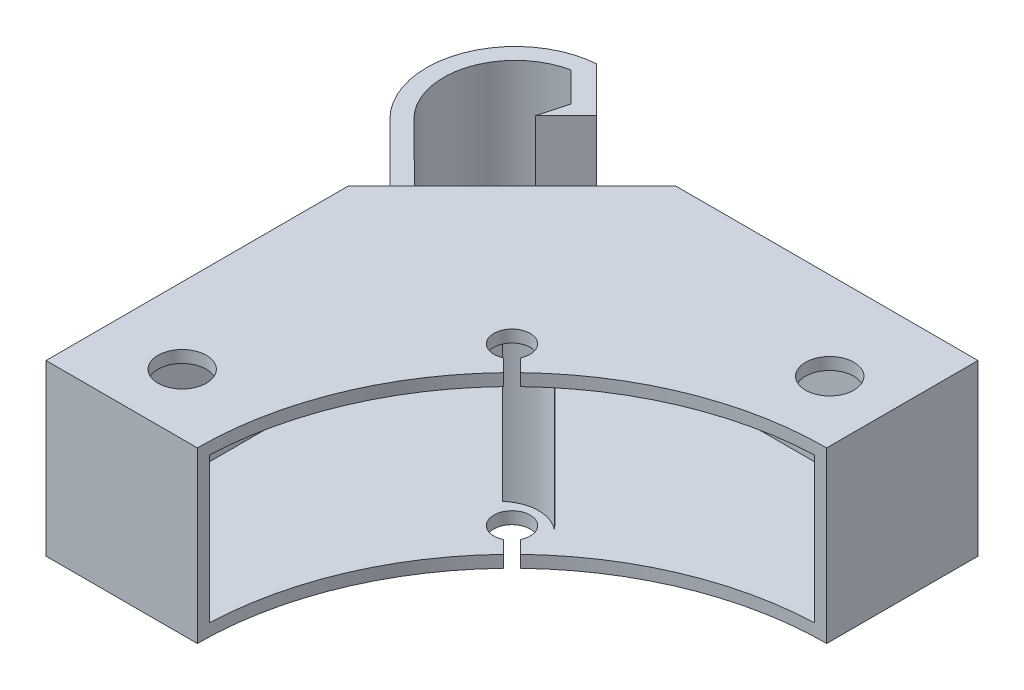
ISO-10303-21;
HEADER;
FILE_DESCRIPTION(('STEP AP214'),'2;1');
FILE_NAME('part.step','',(''),(''),'','','');
FILE_SCHEMA(('AUTOMOTIVE_DESIGN { 1 0 10303 214 1 1 1 1 }'));
ENDSEC;
DATA;
#1=APPLICATION_CONTEXT('core data for automotive mechanical design processes');
#2=APPLICATION_PROTOCOL_DEFINITION('international standard','automotive_design',2000,#1);
#3=PRODUCT_CONTEXT('',#1,'mechanical');
#4=PRODUCT('Part','Part','',(#3));
#5=PRODUCT_RELATED_PRODUCT_CATEGORY('part','',(#4));
#6=PRODUCT_DEFINITION_FORMATION('','',#4);
#7=PRODUCT_DEFINITION_CONTEXT('part definition',#1,'design');
#8=PRODUCT_DEFINITION('design','',#6,#7);
#9=PRODUCT_DEFINITION_SHAPE('','',#8);
#10=(LENGTH_UNIT() NAMED_UNIT(*) SI_UNIT(.MILLI.,.METRE.));
#11=(NAMED_UNIT(*) PLANE_ANGLE_UNIT() SI_UNIT($,.RADIAN.));
#12=(NAMED_UNIT(*) SI_UNIT($,.STERADIAN.) SOLID_ANGLE_UNIT());
#13=UNCERTAINTY_MEASURE_WITH_UNIT(LENGTH_MEASURE(1.E-05),#10,'distance_accuracy_value','');
#14=(GEOMETRIC_REPRESENTATION_CONTEXT(3) GLOBAL_UNCERTAINTY_ASSIGNED_CONTEXT((#13)) GLOBAL_UNIT_ASSIGNED_CONTEXT((#10,
#11,#12)) REPRESENTATION_CONTEXT('',''));
#15=CARTESIAN_POINT('',(0.,0.,0.));
#16=DIRECTION('',(0.,0.,1.));
#17=DIRECTION('',(1.,0.,0.));
#18=AXIS2_PLACEMENT_3D('',#15,#16,#17);
#19=CARTESIAN_POINT('',(-20.50609665441,27.,-71.9203102167828));
#20=DIRECTION('',(0.,-1.,0.));
#21=DIRECTION('',(0.,0.,-1.));
#22=AXIS2_PLACEMENT_3D('',#19,#20,#21);
#23=PLANE('',#22);
#24=DIRECTION('',(0.71037370162736,0.,0.703824696949633));
#25=VECTOR('',#24,1.);
#26=CARTESIAN_POINT('',(-15.8873615053741,27.,-76.5820221443081));
#27=LINE('',#26,#25);
#28=CARTESIAN_POINT('',(-5.15351595946739,27.,-65.9471329709827));
#29=VERTEX_POINT('',#28);
#30=CARTESIAN_POINT('',(5.44566595344239,27.,-55.4456659534424));
#31=VERTEX_POINT('',#30);
#32=EDGE_CURVE('E285',#29,#31,#27,.T.);
#33=ORIENTED_EDGE('',*,*,#32,.F.);
#34=CARTESIAN_POINT('',(3.17640056931442,27.,-74.3545583773991));
#35=DIRECTION('',(0.,-1.,0.));
#36=DIRECTION('',(0.,0.,-1.));
#37=AXIS2_PLACEMENT_3D('',#34,#35,#36);
#38=CIRCLE('',#37,11.8352148835975);
#39=CARTESIAN_POINT('',(0.807292373089444,27.,-85.9502316090622));
#40=VERTEX_POINT('',#39);
#41=EDGE_CURVE('E281',#40,#29,#38,.F.);
#42=ORIENTED_EDGE('',*,*,#41,.F.);
#43=DIRECTION('',(-0.707106781186548,0.,-0.707106781186547));
#44=VECTOR('',#43,1.);
#45=CARTESIAN_POINT('',(-2.83444144452059,27.,-89.5919654266722));
#46=LINE('',#45,#44);
#47=CARTESIAN_POINT('',(5.67104255263289,27.,-81.0864814295187));
#48=VERTEX_POINT('',#47);
#49=EDGE_CURVE('E277',#48,#40,#46,.T.);
#50=ORIENTED_EDGE('',*,*,#49,.F.);
#51=DIRECTION('',(0.265706176141184,0.,-0.964054058629717));
#52=VECTOR('',#51,1.);
#53=CARTESIAN_POINT('',(1.47498082783507,27.,-65.8620316451724));
#54=LINE('',#53,#52);
#55=CARTESIAN_POINT('',(4.41044873230969,27.,-76.512705213943));
#56=VERTEX_POINT('',#55);
#57=EDGE_CURVE('E270',#56,#48,#54,.T.);
#58=ORIENTED_EDGE('',*,*,#57,.F.);
#59=DIRECTION('',(-0.707106781186547,0.,0.707106781186548));
#60=VECTOR('',#59,1.);
#61=CARTESIAN_POINT('',(-10.3440214596303,27.,-61.758235022003));
#62=LINE('',#61,#60);
#63=CARTESIAN_POINT('',(9.4489540938188,27.,-81.5512105754521));
#64=VERTEX_POINT('',#63);
#65=EDGE_CURVE('E264',#64,#56,#62,.T.);
#66=ORIENTED_EDGE('',*,*,#65,.F.);
#67=DIRECTION('',(0.707106781186548,0.,0.707106781186547));
#68=VECTOR('',#67,1.);
#69=CARTESIAN_POINT('',(-0.713121100960917,27.,-91.7132857702318));
#70=LINE('',#69,#68);
#71=CARTESIAN_POINT('',(2.04781425632615,27.,-88.9523504129448));
#72=VERTEX_POINT('',#71);
#73=EDGE_CURVE('E243',#72,#64,#70,.T.);
#74=ORIENTED_EDGE('',*,*,#73,.F.);
#75=CARTESIAN_POINT('',(3.17640056931442,27.,-74.3545583773991));
#76=DIRECTION('',(0.,-1.,0.));
#77=DIRECTION('',(0.,0.,-1.));
#78=AXIS2_PLACEMENT_3D('',#75,#76,#77);
#79=CIRCLE('',#78,14.641353741335);
#80=CARTESIAN_POINT('',(-7.17659994693462,27.,-64.00155786115));
#81=VERTEX_POINT('',#80);
#82=EDGE_CURVE('E251',#81,#72,#79,.T.);
#83=ORIENTED_EDGE('',*,*,#82,.F.);
#84=DIRECTION('',(-0.707106781186547,0.,-0.707106781186548));
#85=VECTOR('',#84,1.);
#86=CARTESIAN_POINT('',(-17.8007244784887,27.,-74.6256823927041));
#87=LINE('',#86,#85);
#88=CARTESIAN_POINT('',(3.41247895710775,27.,-53.4124789571077));
#89=VERTEX_POINT('',#88);
#90=EDGE_CURVE('E259',#89,#81,#87,.T.);
#91=ORIENTED_EDGE('',*,*,#90,.F.);
#92=DIRECTION('',(0.707106781186543,0.,-0.707106781186551));
#93=VECTOR('',#92,1.);
#94=CARTESIAN_POINT('',(0.707106781186548,27.,-50.7071067811865));
#95=LINE('',#94,#93);
#96=EDGE_CURVE('E310',#89,#31,#95,.T.);
#97=ORIENTED_EDGE('',*,*,#96,.T.);
#98=EDGE_LOOP('',(#33,#42,#50,#58,#66,#74,#83,#91,#97));
#99=FACE_BOUND('',#98,.T.);
#100=ADVANCED_FACE('F37',(#99),#23,.F.);
#101=CARTESIAN_POINT('',(26.9999999999998,28.,-77.));
#102=DIRECTION('',(0.707106781186552,0.,0.707106781186543));
#103=DIRECTION('',(0.707106781186543,0.,-0.707106781186552));
#104=AXIS2_PLACEMENT_3D('',#101,#102,#103);
#105=PLANE('',#104);
#106=DIRECTION('',(0.,1.,0.));
#107=VECTOR('',#106,1.);
#108=CARTESIAN_POINT('',(3.41247895710775,-3.,-53.4124789571077));
#109=LINE('',#108,#107);
#110=CARTESIAN_POINT('',(3.41247895710775,1.,-53.4124789571077));
#111=VERTEX_POINT('',#110);
#112=EDGE_CURVE('E311',#111,#89,#109,.T.);
#113=ORIENTED_EDGE('',*,*,#112,.F.);
#114=DIRECTION('',(-0.707106781186543,0.,0.707106781186551));
#115=VECTOR('',#114,1.);
#116=CARTESIAN_POINT('',(26.2928932188132,1.,-76.2928932188134));
#117=LINE('',#116,#115);
#118=CARTESIAN_POINT('',(5.44566595344239,1.,-55.4456659534424));
#119=VERTEX_POINT('',#118);
#120=EDGE_CURVE('E314',#119,#111,#117,.T.);
#121=ORIENTED_EDGE('',*,*,#120,.F.);
#122=DIRECTION('',(0.,1.,0.));
#123=VECTOR('',#122,1.);
#124=CARTESIAN_POINT('',(5.44566595344239,-3.,-55.4456659534424));
#125=LINE('',#124,#123);
#126=EDGE_CURVE('E316',#119,#31,#125,.T.);
#127=ORIENTED_EDGE('',*,*,#126,.T.);
#128=ORIENTED_EDGE('',*,*,#96,.F.);
#129=EDGE_LOOP('',(#113,#121,#127,#128));
#130=FACE_BOUND('',#129,.T.);
#131=DIRECTION('',(-0.707106781186543,0.,0.707106781186552));
#132=VECTOR('',#131,1.);
#133=CARTESIAN_POINT('',(26.9999999999998,0.,-77.));
#134=LINE('',#133,#132);
#135=CARTESIAN_POINT('',(26.9999999999998,0.,-77.));
#136=VERTEX_POINT('',#135);
#137=CARTESIAN_POINT('',(0.,0.,-49.9999999999999));
#138=VERTEX_POINT('',#137);
#139=EDGE_CURVE('E464',#136,#138,#134,.T.);
#140=ORIENTED_EDGE('',*,*,#139,.T.);
#141=DIRECTION('',(0.,-1.,0.));
#142=VECTOR('',#141,1.);
#143=CARTESIAN_POINT('',(0.,28.,-49.9999999999999));
#144=LINE('',#143,#142);
#145=CARTESIAN_POINT('',(0.,28.,-49.9999999999999));
#146=VERTEX_POINT('',#145);
#147=EDGE_CURVE('E469',#146,#138,#144,.T.);
#148=ORIENTED_EDGE('',*,*,#147,.F.);
#149=DIRECTION('',(-0.707106781186543,0.,0.707106781186552));
#150=VECTOR('',#149,1.);
#151=CARTESIAN_POINT('',(26.9999999999998,28.,-77.));
#152=LINE('',#151,#150);
#153=CARTESIAN_POINT('',(26.9999999999998,28.,-77.));
#154=VERTEX_POINT('',#153);
#155=EDGE_CURVE('E439',#154,#146,#152,.T.);
#156=ORIENTED_EDGE('',*,*,#155,.F.);
#157=DIRECTION('',(0.,-1.,0.));
#158=VECTOR('',#157,1.);
#159=CARTESIAN_POINT('',(26.9999999999998,28.,-77.));
#160=LINE('',#159,#158);
#161=EDGE_CURVE('E472',#154,#136,#160,.T.);
#162=ORIENTED_EDGE('',*,*,#161,.T.);
#163=EDGE_LOOP('',(#140,#148,#156,#162));
#164=FACE_BOUND('',#163,.T.);
#165=ADVANCED_FACE('F557',(#130,#164),#105,.F.);
#166=CARTESIAN_POINT('',(39.5301403295098,28.,-36.055646108117));
#167=DIRECTION('',(-0.707106781186547,0.,0.707106781186547));
#168=DIRECTION('',(0.707106781186548,0.,0.707106781186548));
#169=AXIS2_PLACEMENT_3D('',#166,#167,#168);
#170=PLANE('',#169);
#171=DIRECTION('',(-0.707106781186548,0.,-0.707106781186548));
#172=VECTOR('',#171,1.);
#173=CARTESIAN_POINT('',(39.5301403295098,2.,-36.055646108117));
#174=LINE('',#173,#172);
#175=CARTESIAN_POINT('',(39.5301403295098,2.,-36.055646108117));
#176=VERTEX_POINT('',#175);
#177=CARTESIAN_POINT('',(37.4088199859502,2.,-38.1769664516767));
#178=VERTEX_POINT('',#177);
#179=EDGE_CURVE('E353',#176,#178,#174,.T.);
#180=ORIENTED_EDGE('',*,*,#179,.F.);
#181=DIRECTION('',(0.,-1.,0.));
#182=VECTOR('',#181,1.);
#183=CARTESIAN_POINT('',(39.5301403295098,28.,-36.055646108117));
#184=LINE('',#183,#182);
#185=CARTESIAN_POINT('',(39.5301403295098,0.,-36.055646108117));
#186=VERTEX_POINT('',#185);
#187=EDGE_CURVE('E493',#176,#186,#184,.T.);
#188=ORIENTED_EDGE('',*,*,#187,.T.);
#189=DIRECTION('',(-0.707106781186548,0.,-0.707106781186548));
#190=VECTOR('',#189,1.);
#191=CARTESIAN_POINT('',(39.5301403295098,0.,-36.055646108117));
#192=LINE('',#191,#190);
#193=CARTESIAN_POINT('',(37.4088199859502,0.,-38.1769664516767));
#194=VERTEX_POINT('',#193);
#195=EDGE_CURVE('E449',#186,#194,#192,.T.);
#196=ORIENTED_EDGE('',*,*,#195,.T.);
#197=DIRECTION('',(0.,-1.,0.));
#198=VECTOR('',#197,1.);
#199=CARTESIAN_POINT('',(37.4088199859502,28.,-38.1769664516767));
#200=LINE('',#199,#198);
#201=EDGE_CURVE('E489',#178,#194,#200,.T.);
#202=ORIENTED_EDGE('',*,*,#201,.F.);
#203=EDGE_LOOP('',(#180,#188,#196,#202));
#204=FACE_BOUND('',#203,.T.);
#205=ADVANCED_FACE('F527',(#204),#170,.F.);
#206=CARTESIAN_POINT('',(36.1159267671368,28.,-40.8840732328633));
#207=DIRECTION('',(0.,-1.,0.));
#208=DIRECTION('',(0.,0.,-1.));
#209=AXIS2_PLACEMENT_3D('',#206,#207,#208);
#210=CYLINDRICAL_SURFACE('',#209,3.00000000000001);
#211=CARTESIAN_POINT('',(36.1159267671368,2.,-40.8840732328633));
#212=DIRECTION('',(0.,1.,0.));
#213=DIRECTION('',(0.,0.,1.));
#214=AXIS2_PLACEMENT_3D('',#211,#212,#213);
#215=CIRCLE('',#214,3.00000000000001);
#216=CARTESIAN_POINT('',(38.8230335483233,2.,-39.5911800140498));
#217=VERTEX_POINT('',#216);
#218=EDGE_CURVE('E355',#178,#217,#215,.F.);
#219=ORIENTED_EDGE('',*,*,#218,.F.);
#220=ORIENTED_EDGE('',*,*,#201,.T.);
#221=CARTESIAN_POINT('',(36.1159267671368,0.,-40.8840732328633));
#222=DIRECTION('',(0.,-1.,0.));
#223=DIRECTION('',(0.,0.,-1.));
#224=AXIS2_PLACEMENT_3D('',#221,#222,#223);
#225=CIRCLE('',#224,3.00000000000001);
#226=CARTESIAN_POINT('',(38.8230335483233,0.,-39.5911800140498));
#227=VERTEX_POINT('',#226);
#228=EDGE_CURVE('E452',#194,#227,#225,.T.);
#229=ORIENTED_EDGE('',*,*,#228,.T.);
#230=DIRECTION('',(0.,-1.,0.));
#231=VECTOR('',#230,1.);
#232=CARTESIAN_POINT('',(38.8230335483233,28.,-39.5911800140498));
#233=LINE('',#232,#231);
#234=EDGE_CURVE('E485',#217,#227,#233,.T.);
#235=ORIENTED_EDGE('',*,*,#234,.F.);
#236=EDGE_LOOP('',(#219,#220,#229,#235));
#237=FACE_BOUND('',#236,.T.);
#238=ADVANCED_FACE('F579',(#237),#210,.F.);
#239=CARTESIAN_POINT('',(40.9443538918829,28.,-37.4698596704901));
#240=DIRECTION('',(0.707106781186547,0.,-0.707106781186547));
#241=DIRECTION('',(-0.707106781186548,0.,-0.707106781186548));
#242=AXIS2_PLACEMENT_3D('',#239,#240,#241);
#243=PLANE('',#242);
#244=DIRECTION('',(0.707106781186548,0.,0.707106781186548));
#245=VECTOR('',#244,1.);
#246=CARTESIAN_POINT('',(40.9443538918829,2.,-37.4698596704901));
#247=LINE('',#246,#245);
#248=CARTESIAN_POINT('',(40.9443538918829,2.,-37.4698596704902));
#249=VERTEX_POINT('',#248);
#250=EDGE_CURVE('E357',#217,#249,#247,.T.);
#251=ORIENTED_EDGE('',*,*,#250,.F.);
#252=ORIENTED_EDGE('',*,*,#234,.T.);
#253=DIRECTION('',(0.707106781186548,0.,0.707106781186548));
#254=VECTOR('',#253,1.);
#255=CARTESIAN_POINT('',(40.9443538918829,0.,-37.4698596704901));
#256=LINE('',#255,#254);
#257=CARTESIAN_POINT('',(40.9443538918829,0.,-37.4698596704901));
#258=VERTEX_POINT('',#257);
#259=EDGE_CURVE('E455',#227,#258,#256,.T.);
#260=ORIENTED_EDGE('',*,*,#259,.T.);
#261=DIRECTION('',(0.,-1.,0.));
#262=VECTOR('',#261,1.);
#263=CARTESIAN_POINT('',(40.9443538918829,28.,-37.4698596704901));
#264=LINE('',#263,#262);
#265=EDGE_CURVE('E481',#249,#258,#264,.T.);
#266=ORIENTED_EDGE('',*,*,#265,.F.);
#267=EDGE_LOOP('',(#251,#252,#260,#266));
#268=FACE_BOUND('',#267,.T.);
#269=ADVANCED_FACE('F576',(#268),#243,.F.);
#270=CARTESIAN_POINT('',(36.1159267671368,28.,-40.8840732328633));
#271=DIRECTION('',(0.,-1.,0.));
#272=DIRECTION('',(0.,0.,-1.));
#273=AXIS2_PLACEMENT_3D('',#270,#271,#272);
#274=CYLINDRICAL_SURFACE('',#273,5.00000000000001);
#275=CARTESIAN_POINT('',(36.1159267671368,2.,-40.8840732328633));
#276=DIRECTION('',(0.,1.,0.));
#277=DIRECTION('',(0.,0.,1.));
#278=AXIS2_PLACEMENT_3D('',#275,#276,#277);
#279=CIRCLE('',#278,5.00000000000001);
#280=CARTESIAN_POINT('',(31.8958750480032,2.,-43.5657077135182));
#281=VERTEX_POINT('',#280);
#282=CARTESIAN_POINT('',(40.1486244214815,2.,-43.839974047952));
#283=VERTEX_POINT('',#282);
#284=EDGE_CURVE('E409',#281,#283,#279,.F.);
#285=ORIENTED_EDGE('',*,*,#284,.F.);
#286=DIRECTION('',(0.,-1.,0.));
#287=VECTOR('',#286,1.);
#288=CARTESIAN_POINT('',(31.8958750480032,14.,-43.5657077135182));
#289=LINE('',#288,#287);
#290=CARTESIAN_POINT('',(31.8958750480032,26.,-43.5657077135182));
#291=VERTEX_POINT('',#290);
#292=EDGE_CURVE('E350',#281,#291,#289,.F.);
#293=ORIENTED_EDGE('',*,*,#292,.T.);
#294=CARTESIAN_POINT('',(36.1159267671368,26.,-40.8840732328633));
#295=DIRECTION('',(0.,1.,0.));
#296=DIRECTION('',(0.,0.,1.));
#297=AXIS2_PLACEMENT_3D('',#294,#295,#296);
#298=CIRCLE('',#297,5.00000000000001);
#299=CARTESIAN_POINT('',(40.1486244214815,26.,-43.839974047952));
#300=VERTEX_POINT('',#299);
#301=EDGE_CURVE('E406',#291,#300,#298,.F.);
#302=ORIENTED_EDGE('',*,*,#301,.T.);
#303=DIRECTION('',(0.,-1.,0.));
#304=VECTOR('',#303,1.);
#305=CARTESIAN_POINT('',(40.1486244214815,14.,-43.839974047952));
#306=LINE('',#305,#304);
#307=EDGE_CURVE('E347',#300,#283,#306,.T.);
#308=ORIENTED_EDGE('',*,*,#307,.T.);
#309=EDGE_LOOP('',(#285,#293,#302,#308));
#310=FACE_BOUND('',#309,.T.);
#311=ADVANCED_FACE('F626',(#310),#274,.T.);
#312=CARTESIAN_POINT('',(77.,28.,0.));
#313=DIRECTION('',(0.,-1.,0.));
#314=DIRECTION('',(0.,0.,-1.));
#315=AXIS2_PLACEMENT_3D('',#312,#313,#314);
#316=CYLINDRICAL_SURFACE('',#315,52.);
#317=CARTESIAN_POINT('',(77.,26.,0.));
#318=DIRECTION('',(0.,1.,0.));
#319=DIRECTION('',(0.,0.,1.));
#320=AXIS2_PLACEMENT_3D('',#317,#318,#319);
#321=CIRCLE('',#320,52.);
#322=CARTESIAN_POINT('',(25.0384757729337,26.,-2.));
#323=VERTEX_POINT('',#322);
#324=CARTESIAN_POINT('',(39.5301403295098,26.,-36.055646108117));
#325=VERTEX_POINT('',#324);
#326=EDGE_CURVE('E374',#323,#325,#321,.F.);
#327=ORIENTED_EDGE('',*,*,#326,.T.);
#328=CARTESIAN_POINT('',(39.5301403295098,28.,-36.055646108117));
#329=VERTEX_POINT('',#328);
#330=EDGE_CURVE('E494',#329,#325,#184,.T.);
#331=ORIENTED_EDGE('',*,*,#330,.F.);
#332=CARTESIAN_POINT('',(77.,28.,0.));
#333=DIRECTION('',(0.,-1.,0.));
#334=DIRECTION('',(0.,0.,1.));
#335=AXIS2_PLACEMENT_3D('',#332,#333,#334);
#336=CIRCLE('',#335,52.);
#337=CARTESIAN_POINT('',(25.,28.,0.));
#338=VERTEX_POINT('',#337);
#339=EDGE_CURVE('E424',#338,#329,#336,.T.);
#340=ORIENTED_EDGE('',*,*,#339,.F.);
#341=DIRECTION('',(0.,-1.,0.));
#342=VECTOR('',#341,1.);
#343=CARTESIAN_POINT('',(25.,28.,0.));
#344=LINE('',#343,#342);
#345=CARTESIAN_POINT('',(25.,0.,0.));
#346=VERTEX_POINT('',#345);
#347=EDGE_CURVE('E497',#338,#346,#344,.T.);
#348=ORIENTED_EDGE('',*,*,#347,.T.);
#349=CARTESIAN_POINT('',(77.,0.,0.));
#350=DIRECTION('',(0.,-1.,0.));
#351=DIRECTION('',(0.,0.,1.));
#352=AXIS2_PLACEMENT_3D('',#349,#350,#351);
#353=CIRCLE('',#352,52.);
#354=EDGE_CURVE('E446',#346,#186,#353,.T.);
#355=ORIENTED_EDGE('',*,*,#354,.T.);
#356=ORIENTED_EDGE('',*,*,#187,.F.);
#357=CARTESIAN_POINT('',(77.,2.,0.));
#358=DIRECTION('',(0.,1.,0.));
#359=DIRECTION('',(0.,0.,1.));
#360=AXIS2_PLACEMENT_3D('',#357,#358,#359);
#361=CIRCLE('',#360,52.);
#362=CARTESIAN_POINT('',(25.0384757729337,2.,-2.));
#363=VERTEX_POINT('',#362);
#364=EDGE_CURVE('E372',#363,#176,#361,.F.);
#365=ORIENTED_EDGE('',*,*,#364,.F.);
#366=DIRECTION('',(0.,-1.,0.));
#367=VECTOR('',#366,1.);
#368=CARTESIAN_POINT('',(25.0384757729337,26.,-2.));
#369=LINE('',#368,#367);
#370=EDGE_CURVE('E412',#323,#363,#369,.T.);
#371=ORIENTED_EDGE('',*,*,#370,.F.);
#372=EDGE_LOOP('',(#327,#331,#340,#348,#355,#356,#365,#371));
#373=FACE_BOUND('',#372,.T.);
#374=ADVANCED_FACE('F510',(#373),#316,.F.);
#375=CARTESIAN_POINT('',(77.,28.,0.));
#376=DIRECTION('',(0.,-1.,0.));
#377=DIRECTION('',(0.,0.,-1.));
#378=AXIS2_PLACEMENT_3D('',#375,#376,#377);
#379=CYLINDRICAL_SURFACE('',#378,52.);
#380=CARTESIAN_POINT('',(40.9443538918829,28.,-37.4698596704901));
#381=VERTEX_POINT('',#380);
#382=CARTESIAN_POINT('',(40.9443538918829,26.,-37.4698596704902));
#383=VERTEX_POINT('',#382);
#384=EDGE_CURVE('E482',#381,#383,#264,.T.);
#385=ORIENTED_EDGE('',*,*,#384,.T.);
#386=CARTESIAN_POINT('',(77.,26.,0.));
#387=DIRECTION('',(0.,1.,0.));
#388=DIRECTION('',(0.,0.,1.));
#389=AXIS2_PLACEMENT_3D('',#386,#387,#388);
#390=CIRCLE('',#389,52.);
#391=CARTESIAN_POINT('',(75.,26.,-51.9615242270663));
#392=VERTEX_POINT('',#391);
#393=EDGE_CURVE('E405',#383,#392,#390,.F.);
#394=ORIENTED_EDGE('',*,*,#393,.T.);
#395=DIRECTION('',(0.,-1.,0.));
#396=VECTOR('',#395,1.);
#397=CARTESIAN_POINT('',(75.,26.,-51.9615242270663));
#398=LINE('',#397,#396);
#399=CARTESIAN_POINT('',(75.,2.,-51.9615242270663));
#400=VERTEX_POINT('',#399);
#401=EDGE_CURVE('E401',#392,#400,#398,.T.);
#402=ORIENTED_EDGE('',*,*,#401,.T.);
#403=CARTESIAN_POINT('',(77.,2.,0.));
#404=DIRECTION('',(0.,1.,0.));
#405=DIRECTION('',(0.,0.,1.));
#406=AXIS2_PLACEMENT_3D('',#403,#404,#405);
#407=CIRCLE('',#406,52.);
#408=EDGE_CURVE('E403',#249,#400,#407,.F.);
#409=ORIENTED_EDGE('',*,*,#408,.F.);
#410=ORIENTED_EDGE('',*,*,#265,.T.);
#411=CARTESIAN_POINT('',(77.,0.,0.));
#412=DIRECTION('',(0.,-1.,0.));
#413=DIRECTION('',(0.,0.,-1.));
#414=AXIS2_PLACEMENT_3D('',#411,#412,#413);
#415=CIRCLE('',#414,52.);
#416=CARTESIAN_POINT('',(77.,0.,-52.));
#417=VERTEX_POINT('',#416);
#418=EDGE_CURVE('E458',#258,#417,#415,.T.);
#419=ORIENTED_EDGE('',*,*,#418,.T.);
#420=DIRECTION('',(0.,-1.,0.));
#421=VECTOR('',#420,1.);
#422=CARTESIAN_POINT('',(77.,28.,-52.));
#423=LINE('',#422,#421);
#424=CARTESIAN_POINT('',(77.,28.,-52.));
#425=VERTEX_POINT('',#424);
#426=EDGE_CURVE('E478',#425,#417,#423,.T.);
#427=ORIENTED_EDGE('',*,*,#426,.F.);
#428=CARTESIAN_POINT('',(77.,28.,0.));
#429=DIRECTION('',(0.,-1.,0.));
#430=DIRECTION('',(0.,0.,-1.));
#431=AXIS2_PLACEMENT_3D('',#428,#429,#430);
#432=CIRCLE('',#431,52.);
#433=EDGE_CURVE('E433',#381,#425,#432,.T.);
#434=ORIENTED_EDGE('',*,*,#433,.F.);
#435=EDGE_LOOP('',(#385,#394,#402,#409,#410,#419,#427,#434));
#436=FACE_BOUND('',#435,.T.);
#437=ADVANCED_FACE('F572',(#436),#379,.F.);
#438=CARTESIAN_POINT('',(0.,28.,0.));
#439=DIRECTION('',(0.,0.,-1.));
#440=DIRECTION('',(-1.,0.,0.));
#441=AXIS2_PLACEMENT_3D('',#438,#439,#440);
#442=PLANE('',#441);
#443=DIRECTION('',(1.,0.,0.));
#444=VECTOR('',#443,1.);
#445=CARTESIAN_POINT('',(0.,0.,0.));
#446=LINE('',#445,#444);
#447=CARTESIAN_POINT('',(0.,0.,0.));
#448=VERTEX_POINT('',#447);
#449=EDGE_CURVE('E414',#448,#346,#446,.T.);
#450=ORIENTED_EDGE('',*,*,#449,.T.);
#451=ORIENTED_EDGE('',*,*,#347,.F.);
#452=DIRECTION('',(1.,0.,0.));
#453=VECTOR('',#452,1.);
#454=CARTESIAN_POINT('',(0.,28.,0.));
#455=LINE('',#454,#453);
#456=CARTESIAN_POINT('',(0.,28.,0.));
#457=VERTEX_POINT('',#456);
#458=EDGE_CURVE('E421',#457,#338,#455,.T.);
#459=ORIENTED_EDGE('',*,*,#458,.F.);
#460=DIRECTION('',(0.,-1.,0.));
#461=VECTOR('',#460,1.);
#462=CARTESIAN_POINT('',(0.,28.,0.));
#463=LINE('',#462,#461);
#464=EDGE_CURVE('E443',#457,#448,#463,.T.);
#465=ORIENTED_EDGE('',*,*,#464,.T.);
#466=EDGE_LOOP('',(#450,#451,#459,#465));
#467=FACE_BOUND('',#466,.T.);
#468=ADVANCED_FACE('F39',(#467),#442,.F.);
#469=ORIENTED_EDGE('',*,*,#330,.T.);
#470=DIRECTION('',(-0.707106781186548,0.,-0.707106781186548));
#471=VECTOR('',#470,1.);
#472=CARTESIAN_POINT('',(39.5301403295098,26.,-36.055646108117));
#473=LINE('',#472,#471);
#474=CARTESIAN_POINT('',(37.4088199859502,26.,-38.1769664516767));
#475=VERTEX_POINT('',#474);
#476=EDGE_CURVE('E360',#325,#475,#473,.T.);
#477=ORIENTED_EDGE('',*,*,#476,.T.);
#478=CARTESIAN_POINT('',(37.4088199859502,28.,-38.1769664516767));
#479=VERTEX_POINT('',#478);
#480=EDGE_CURVE('E490',#479,#475,#200,.T.);
#481=ORIENTED_EDGE('',*,*,#480,.F.);
#482=DIRECTION('',(-0.707106781186548,0.,-0.707106781186548));
#483=VECTOR('',#482,1.);
#484=CARTESIAN_POINT('',(39.5301403295098,28.,-36.055646108117));
#485=LINE('',#484,#483);
#486=EDGE_CURVE('E427',#329,#479,#485,.T.);
#487=ORIENTED_EDGE('',*,*,#486,.F.);
#488=EDGE_LOOP('',(#469,#477,#481,#487));
#489=FACE_BOUND('',#488,.T.);
#490=ADVANCED_FACE('F546',(#489),#170,.F.);
#491=ORIENTED_EDGE('',*,*,#480,.T.);
#492=CARTESIAN_POINT('',(36.1159267671368,26.,-40.8840732328633));
#493=DIRECTION('',(0.,1.,0.));
#494=DIRECTION('',(0.,0.,1.));
#495=AXIS2_PLACEMENT_3D('',#492,#493,#494);
#496=CIRCLE('',#495,3.00000000000001);
#497=CARTESIAN_POINT('',(38.8230335483233,26.,-39.5911800140498));
#498=VERTEX_POINT('',#497);
#499=EDGE_CURVE('E363',#475,#498,#496,.F.);
#500=ORIENTED_EDGE('',*,*,#499,.T.);
#501=CARTESIAN_POINT('',(38.8230335483233,28.,-39.5911800140498));
#502=VERTEX_POINT('',#501);
#503=EDGE_CURVE('E486',#502,#498,#233,.T.);
#504=ORIENTED_EDGE('',*,*,#503,.F.);
#505=CARTESIAN_POINT('',(36.1159267671368,28.,-40.8840732328633));
#506=DIRECTION('',(0.,-1.,0.));
#507=DIRECTION('',(0.,0.,-1.));
#508=AXIS2_PLACEMENT_3D('',#505,#506,#507);
#509=CIRCLE('',#508,3.00000000000001);
#510=EDGE_CURVE('E429',#479,#502,#509,.T.);
#511=ORIENTED_EDGE('',*,*,#510,.F.);
#512=EDGE_LOOP('',(#491,#500,#504,#511));
#513=FACE_BOUND('',#512,.T.);
#514=ADVANCED_FACE('F592',(#513),#210,.F.);
#515=ORIENTED_EDGE('',*,*,#503,.T.);
#516=DIRECTION('',(0.707106781186548,0.,0.707106781186548));
#517=VECTOR('',#516,1.);
#518=CARTESIAN_POINT('',(40.9443538918829,26.,-37.4698596704901));
#519=LINE('',#518,#517);
#520=EDGE_CURVE('E366',#498,#383,#519,.T.);
#521=ORIENTED_EDGE('',*,*,#520,.T.);
#522=ORIENTED_EDGE('',*,*,#384,.F.);
#523=DIRECTION('',(0.707106781186548,0.,0.707106781186548));
#524=VECTOR('',#523,1.);
#525=CARTESIAN_POINT('',(40.9443538918829,28.,-37.4698596704901));
#526=LINE('',#525,#524);
#527=EDGE_CURVE('E431',#502,#381,#526,.T.);
#528=ORIENTED_EDGE('',*,*,#527,.F.);
#529=EDGE_LOOP('',(#515,#521,#522,#528));
#530=FACE_BOUND('',#529,.T.);
#531=ADVANCED_FACE('F589',(#530),#243,.F.);
#532=CARTESIAN_POINT('',(77.,28.,-77.));
#533=DIRECTION('',(-1.,0.,0.));
#534=DIRECTION('',(0.,0.,1.));
#535=AXIS2_PLACEMENT_3D('',#532,#533,#534);
#536=PLANE('',#535);
#537=DIRECTION('',(0.,0.,-1.));
#538=VECTOR('',#537,1.);
#539=CARTESIAN_POINT('',(77.,0.,-77.));
#540=LINE('',#539,#538);
#541=CARTESIAN_POINT('',(77.,0.,-77.));
#542=VERTEX_POINT('',#541);
#543=EDGE_CURVE('E460',#417,#542,#540,.T.);
#544=ORIENTED_EDGE('',*,*,#543,.T.);
#545=DIRECTION('',(0.,-1.,0.));
#546=VECTOR('',#545,1.);
#547=CARTESIAN_POINT('',(77.,28.,-77.));
#548=LINE('',#547,#546);
#549=CARTESIAN_POINT('',(77.,28.,-77.));
#550=VERTEX_POINT('',#549);
#551=EDGE_CURVE('E475',#550,#542,#548,.T.);
#552=ORIENTED_EDGE('',*,*,#551,.F.);
#553=DIRECTION('',(0.,0.,-1.));
#554=VECTOR('',#553,1.);
#555=CARTESIAN_POINT('',(77.,28.,-77.));
#556=LINE('',#555,#554);
#557=EDGE_CURVE('E435',#425,#550,#556,.T.);
#558=ORIENTED_EDGE('',*,*,#557,.F.);
#559=ORIENTED_EDGE('',*,*,#426,.T.);
#560=EDGE_LOOP('',(#544,#552,#558,#559));
#561=FACE_BOUND('',#560,.T.);
#562=ADVANCED_FACE('F568',(#561),#536,.F.);
#563=CARTESIAN_POINT('',(26.9999999999998,28.,-77.));
#564=DIRECTION('',(0.,0.,1.));
#565=DIRECTION('',(1.,0.,0.));
#566=AXIS2_PLACEMENT_3D('',#563,#564,#565);
#567=PLANE('',#566);
#568=DIRECTION('',(-1.,0.,0.));
#569=VECTOR('',#568,1.);
#570=CARTESIAN_POINT('',(26.9999999999998,0.,-77.));
#571=LINE('',#570,#569);
#572=EDGE_CURVE('E462',#542,#136,#571,.T.);
#573=ORIENTED_EDGE('',*,*,#572,.T.);
#574=ORIENTED_EDGE('',*,*,#161,.F.);
#575=DIRECTION('',(-1.,0.,0.));
#576=VECTOR('',#575,1.);
#577=CARTESIAN_POINT('',(26.9999999999998,28.,-77.));
#578=LINE('',#577,#576);
#579=EDGE_CURVE('E437',#550,#154,#578,.T.);
#580=ORIENTED_EDGE('',*,*,#579,.F.);
#581=ORIENTED_EDGE('',*,*,#551,.T.);
#582=EDGE_LOOP('',(#573,#574,#580,#581));
#583=FACE_BOUND('',#582,.T.);
#584=ADVANCED_FACE('F563',(#583),#567,.F.);
#585=CARTESIAN_POINT('',(0.,28.,0.));
#586=DIRECTION('',(1.,0.,0.));
#587=DIRECTION('',(0.,0.,-1.));
#588=AXIS2_PLACEMENT_3D('',#585,#586,#587);
#589=PLANE('',#588);
#590=DIRECTION('',(0.,0.,1.));
#591=VECTOR('',#590,1.);
#592=CARTESIAN_POINT('',(0.,0.,0.));
#593=LINE('',#592,#591);
#594=EDGE_CURVE('E425',#138,#448,#593,.T.);
#595=ORIENTED_EDGE('',*,*,#594,.T.);
#596=ORIENTED_EDGE('',*,*,#464,.F.);
#597=DIRECTION('',(0.,0.,1.));
#598=VECTOR('',#597,1.);
#599=CARTESIAN_POINT('',(0.,28.,0.));
#600=LINE('',#599,#598);
#601=EDGE_CURVE('E441',#146,#457,#600,.T.);
#602=ORIENTED_EDGE('',*,*,#601,.F.);
#603=ORIENTED_EDGE('',*,*,#147,.T.);
#604=EDGE_LOOP('',(#595,#596,#602,#603));
#605=FACE_BOUND('',#604,.T.);
#606=ADVANCED_FACE('F555',(#605),#589,.F.);
#607=CARTESIAN_POINT('',(77.,28.,0.));
#608=DIRECTION('',(0.,1.,0.));
#609=DIRECTION('',(0.,0.,1.));
#610=AXIS2_PLACEMENT_3D('',#607,#608,#609);
#611=PLANE('',#610);
#612=CARTESIAN_POINT('',(12.5,28.,-10.));
#613=DIRECTION('',(0.,1.,0.));
#614=DIRECTION('',(0.,0.,1.));
#615=AXIS2_PLACEMENT_3D('',#612,#613,#614);
#616=CIRCLE('',#615,4.);
#617=CARTESIAN_POINT('',(12.5,28.,-6.));
#618=VERTEX_POINT('',#617);
#619=EDGE_CURVE('E330',#618,#618,#616,.T.);
#620=ORIENTED_EDGE('',*,*,#619,.F.);
#621=EDGE_LOOP('',(#620));
#622=FACE_BOUND('',#621,.T.);
#623=CARTESIAN_POINT('',(67.,28.,-62.5));
#624=DIRECTION('',(0.,1.,0.));
#625=DIRECTION('',(0.,0.,1.));
#626=AXIS2_PLACEMENT_3D('',#623,#624,#625);
#627=CIRCLE('',#626,4.00000000000001);
#628=CARTESIAN_POINT('',(67.,28.,-58.5));
#629=VERTEX_POINT('',#628);
#630=EDGE_CURVE('E334',#629,#629,#627,.T.);
#631=ORIENTED_EDGE('',*,*,#630,.F.);
#632=EDGE_LOOP('',(#631));
#633=FACE_BOUND('',#632,.T.);
#634=ORIENTED_EDGE('',*,*,#458,.T.);
#635=ORIENTED_EDGE('',*,*,#339,.T.);
#636=ORIENTED_EDGE('',*,*,#486,.T.);
#637=ORIENTED_EDGE('',*,*,#510,.T.);
#638=ORIENTED_EDGE('',*,*,#527,.T.);
#639=ORIENTED_EDGE('',*,*,#433,.T.);
#640=ORIENTED_EDGE('',*,*,#557,.T.);
#641=ORIENTED_EDGE('',*,*,#579,.T.);
#642=ORIENTED_EDGE('',*,*,#155,.T.);
#643=ORIENTED_EDGE('',*,*,#601,.T.);
#644=EDGE_LOOP('',(#634,#635,#636,#637,#638,#639,#640,#641,#642,#643));
#645=FACE_BOUND('',#644,.T.);
#646=ADVANCED_FACE('F549',(#622,#633,#645),#611,.T.);
#647=CARTESIAN_POINT('',(77.,0.,0.));
#648=DIRECTION('',(0.,1.,0.));
#649=DIRECTION('',(0.,0.,1.));
#650=AXIS2_PLACEMENT_3D('',#647,#648,#649);
#651=PLANE('',#650);
#652=ORIENTED_EDGE('',*,*,#449,.F.);
#653=ORIENTED_EDGE('',*,*,#594,.F.);
#654=ORIENTED_EDGE('',*,*,#139,.F.);
#655=ORIENTED_EDGE('',*,*,#572,.F.);
#656=ORIENTED_EDGE('',*,*,#543,.F.);
#657=ORIENTED_EDGE('',*,*,#418,.F.);
#658=ORIENTED_EDGE('',*,*,#259,.F.);
#659=ORIENTED_EDGE('',*,*,#228,.F.);
#660=ORIENTED_EDGE('',*,*,#195,.F.);
#661=ORIENTED_EDGE('',*,*,#354,.F.);
#662=EDGE_LOOP('',(#652,#653,#654,#655,#656,#657,#658,#659,#660,#661));
#663=FACE_BOUND('',#662,.T.);
#664=ADVANCED_FACE('F520',(#663),#651,.F.);
#665=CARTESIAN_POINT('',(0.,28.,-2.));
#666=DIRECTION('',(0.,0.,-1.));
#667=DIRECTION('',(-1.,0.,0.));
#668=AXIS2_PLACEMENT_3D('',#665,#666,#667);
#669=PLANE('',#668);
#670=DIRECTION('',(1.,0.,0.));
#671=VECTOR('',#670,1.);
#672=CARTESIAN_POINT('',(0.,2.,-2.));
#673=LINE('',#672,#671);
#674=CARTESIAN_POINT('',(2.,2.,-2.));
#675=VERTEX_POINT('',#674);
#676=EDGE_CURVE('E369',#675,#363,#673,.T.);
#677=ORIENTED_EDGE('',*,*,#676,.F.);
#678=DIRECTION('',(0.,-1.,0.));
#679=VECTOR('',#678,1.);
#680=CARTESIAN_POINT('',(2.,28.,-2.));
#681=LINE('',#680,#679);
#682=CARTESIAN_POINT('',(2.,26.,-2.));
#683=VERTEX_POINT('',#682);
#684=EDGE_CURVE('E376',#683,#675,#681,.T.);
#685=ORIENTED_EDGE('',*,*,#684,.F.);
#686=DIRECTION('',(1.,0.,0.));
#687=VECTOR('',#686,1.);
#688=CARTESIAN_POINT('',(0.,26.,-2.));
#689=LINE('',#688,#687);
#690=EDGE_CURVE('E60',#683,#323,#689,.T.);
#691=ORIENTED_EDGE('',*,*,#690,.T.);
#692=ORIENTED_EDGE('',*,*,#370,.T.);
#693=EDGE_LOOP('',(#677,#685,#691,#692));
#694=FACE_BOUND('',#693,.T.);
#695=ADVANCED_FACE('F535',(#694),#669,.T.);
#696=CARTESIAN_POINT('',(75.,28.,-77.));
#697=DIRECTION('',(-1.,0.,0.));
#698=DIRECTION('',(0.,0.,1.));
#699=AXIS2_PLACEMENT_3D('',#696,#697,#698);
#700=PLANE('',#699);
#701=DIRECTION('',(0.,0.,-1.));
#702=VECTOR('',#701,1.);
#703=CARTESIAN_POINT('',(75.,2.,-77.));
#704=LINE('',#703,#702);
#705=CARTESIAN_POINT('',(75.,2.,-75.));
#706=VERTEX_POINT('',#705);
#707=EDGE_CURVE('E396',#400,#706,#704,.T.);
#708=ORIENTED_EDGE('',*,*,#707,.F.);
#709=ORIENTED_EDGE('',*,*,#401,.F.);
#710=DIRECTION('',(0.,0.,-1.));
#711=VECTOR('',#710,1.);
#712=CARTESIAN_POINT('',(75.,26.,-77.));
#713=LINE('',#712,#711);
#714=CARTESIAN_POINT('',(75.,26.,-75.));
#715=VERTEX_POINT('',#714);
#716=EDGE_CURVE('E398',#392,#715,#713,.T.);
#717=ORIENTED_EDGE('',*,*,#716,.T.);
#718=DIRECTION('',(0.,-1.,0.));
#719=VECTOR('',#718,1.);
#720=CARTESIAN_POINT('',(75.,28.,-75.));
#721=LINE('',#720,#719);
#722=EDGE_CURVE('E394',#715,#706,#721,.T.);
#723=ORIENTED_EDGE('',*,*,#722,.T.);
#724=EDGE_LOOP('',(#708,#709,#717,#723));
#725=FACE_BOUND('',#724,.T.);
#726=ADVANCED_FACE('F583',(#725),#700,.T.);
#727=CARTESIAN_POINT('',(26.9999999999998,28.,-75.));
#728=DIRECTION('',(0.,0.,1.));
#729=DIRECTION('',(1.,0.,0.));
#730=AXIS2_PLACEMENT_3D('',#727,#728,#729);
#731=PLANE('',#730);
#732=DIRECTION('',(-1.,0.,0.));
#733=VECTOR('',#732,1.);
#734=CARTESIAN_POINT('',(26.9999999999998,2.,-75.));
#735=LINE('',#734,#733);
#736=CARTESIAN_POINT('',(27.828427124746,2.,-75.));
#737=VERTEX_POINT('',#736);
#738=EDGE_CURVE('E389',#706,#737,#735,.T.);
#739=ORIENTED_EDGE('',*,*,#738,.F.);
#740=ORIENTED_EDGE('',*,*,#722,.F.);
#741=DIRECTION('',(-1.,0.,0.));
#742=VECTOR('',#741,1.);
#743=CARTESIAN_POINT('',(26.9999999999998,26.,-75.));
#744=LINE('',#743,#742);
#745=CARTESIAN_POINT('',(27.828427124746,26.,-75.));
#746=VERTEX_POINT('',#745);
#747=EDGE_CURVE('E391',#715,#746,#744,.T.);
#748=ORIENTED_EDGE('',*,*,#747,.T.);
#749=DIRECTION('',(0.,-1.,0.));
#750=VECTOR('',#749,1.);
#751=CARTESIAN_POINT('',(27.828427124746,28.,-75.));
#752=LINE('',#751,#750);
#753=EDGE_CURVE('E387',#746,#737,#752,.T.);
#754=ORIENTED_EDGE('',*,*,#753,.T.);
#755=EDGE_LOOP('',(#739,#740,#748,#754));
#756=FACE_BOUND('',#755,.T.);
#757=ADVANCED_FACE('F632',(#756),#731,.T.);
#758=CARTESIAN_POINT('',(28.4142135623729,28.,-75.5857864376269));
#759=DIRECTION('',(0.707106781186552,0.,0.707106781186543));
#760=DIRECTION('',(0.707106781186543,0.,-0.707106781186552));
#761=AXIS2_PLACEMENT_3D('',#758,#759,#760);
#762=PLANE('',#761);
#763=DIRECTION('',(-0.707106781186543,0.,0.707106781186552));
#764=VECTOR('',#763,1.);
#765=CARTESIAN_POINT('',(28.4142135623729,2.,-75.5857864376269));
#766=LINE('',#765,#764);
#767=CARTESIAN_POINT('',(2.,2.,-49.1715728752537));
#768=VERTEX_POINT('',#767);
#769=EDGE_CURVE('E382',#737,#768,#766,.T.);
#770=ORIENTED_EDGE('',*,*,#769,.F.);
#771=ORIENTED_EDGE('',*,*,#753,.F.);
#772=DIRECTION('',(-0.707106781186543,0.,0.707106781186552));
#773=VECTOR('',#772,1.);
#774=CARTESIAN_POINT('',(28.4142135623729,26.,-75.5857864376269));
#775=LINE('',#774,#773);
#776=CARTESIAN_POINT('',(2.,26.,-49.1715728752537));
#777=VERTEX_POINT('',#776);
#778=EDGE_CURVE('E384',#746,#777,#775,.T.);
#779=ORIENTED_EDGE('',*,*,#778,.T.);
#780=DIRECTION('',(0.,-1.,0.));
#781=VECTOR('',#780,1.);
#782=CARTESIAN_POINT('',(2.,28.,-49.1715728752537));
#783=LINE('',#782,#781);
#784=EDGE_CURVE('E379',#777,#768,#783,.T.);
#785=ORIENTED_EDGE('',*,*,#784,.T.);
#786=EDGE_LOOP('',(#770,#771,#779,#785));
#787=FACE_BOUND('',#786,.T.);
#788=ADVANCED_FACE('F635',(#787),#762,.T.);
#789=CARTESIAN_POINT('',(2.,28.,0.));
#790=DIRECTION('',(1.,0.,0.));
#791=DIRECTION('',(0.,0.,-1.));
#792=AXIS2_PLACEMENT_3D('',#789,#790,#791);
#793=PLANE('',#792);
#794=DIRECTION('',(0.,0.,1.));
#795=VECTOR('',#794,1.);
#796=CARTESIAN_POINT('',(2.,2.,0.));
#797=LINE('',#796,#795);
#798=EDGE_CURVE('E375',#768,#675,#797,.T.);
#799=ORIENTED_EDGE('',*,*,#798,.F.);
#800=ORIENTED_EDGE('',*,*,#784,.F.);
#801=DIRECTION('',(0.,0.,1.));
#802=VECTOR('',#801,1.);
#803=CARTESIAN_POINT('',(2.,26.,0.));
#804=LINE('',#803,#802);
#805=EDGE_CURVE('E380',#777,#683,#804,.T.);
#806=ORIENTED_EDGE('',*,*,#805,.T.);
#807=ORIENTED_EDGE('',*,*,#684,.T.);
#808=EDGE_LOOP('',(#799,#800,#806,#807));
#809=FACE_BOUND('',#808,.T.);
#810=ADVANCED_FACE('F639',(#809),#793,.T.);
#811=CARTESIAN_POINT('',(77.,26.,0.));
#812=DIRECTION('',(0.,1.,0.));
#813=DIRECTION('',(0.,0.,1.));
#814=AXIS2_PLACEMENT_3D('',#811,#812,#813);
#815=PLANE('',#814);
#816=CARTESIAN_POINT('',(12.5,26.,-10.));
#817=DIRECTION('',(0.,1.,0.));
#818=DIRECTION('',(0.,0.,1.));
#819=AXIS2_PLACEMENT_3D('',#816,#817,#818);
#820=CIRCLE('',#819,4.);
#821=CARTESIAN_POINT('',(12.5,26.,-6.));
#822=VERTEX_POINT('',#821);
#823=EDGE_CURVE('E331',#822,#822,#820,.T.);
#824=ORIENTED_EDGE('',*,*,#823,.T.);
#825=EDGE_LOOP('',(#824));
#826=FACE_BOUND('',#825,.T.);
#827=CARTESIAN_POINT('',(67.,26.,-62.5));
#828=DIRECTION('',(0.,1.,0.));
#829=DIRECTION('',(0.,0.,1.));
#830=AXIS2_PLACEMENT_3D('',#827,#828,#829);
#831=CIRCLE('',#830,4.00000000000001);
#832=CARTESIAN_POINT('',(67.,26.,-58.5));
#833=VERTEX_POINT('',#832);
#834=EDGE_CURVE('E337',#833,#833,#831,.T.);
#835=ORIENTED_EDGE('',*,*,#834,.T.);
#836=EDGE_LOOP('',(#835));
#837=FACE_BOUND('',#836,.T.);
#838=ORIENTED_EDGE('',*,*,#301,.F.);
#839=CARTESIAN_POINT('',(36.1846782661602,26.,-38.8153217338398));
#840=DIRECTION('',(0.,1.,0.));
#841=DIRECTION('',(0.,0.,1.));
#842=AXIS2_PLACEMENT_3D('',#839,#840,#841);
#843=CIRCLE('',#842,6.40000000000001);
#844=EDGE_CURVE('E345',#300,#291,#843,.T.);
#845=ORIENTED_EDGE('',*,*,#844,.F.);
#846=EDGE_LOOP('',(#838,#845));
#847=FACE_BOUND('',#846,.T.);
#848=ORIENTED_EDGE('',*,*,#716,.F.);
#849=ORIENTED_EDGE('',*,*,#393,.F.);
#850=ORIENTED_EDGE('',*,*,#520,.F.);
#851=ORIENTED_EDGE('',*,*,#499,.F.);
#852=ORIENTED_EDGE('',*,*,#476,.F.);
#853=ORIENTED_EDGE('',*,*,#326,.F.);
#854=ORIENTED_EDGE('',*,*,#690,.F.);
#855=ORIENTED_EDGE('',*,*,#805,.F.);
#856=ORIENTED_EDGE('',*,*,#778,.F.);
#857=ORIENTED_EDGE('',*,*,#747,.F.);
#858=EDGE_LOOP('',(#848,#849,#850,#851,#852,#853,#854,#855,#856,#857));
#859=FACE_BOUND('',#858,.T.);
#860=ADVANCED_FACE('F540',(#826,#837,#847,#859),#815,.F.);
#861=CARTESIAN_POINT('',(77.,2.,0.));
#862=DIRECTION('',(0.,1.,0.));
#863=DIRECTION('',(0.,0.,1.));
#864=AXIS2_PLACEMENT_3D('',#861,#862,#863);
#865=PLANE('',#864);
#866=CARTESIAN_POINT('',(36.1846782661602,2.,-38.8153217338398));
#867=DIRECTION('',(0.,1.,0.));
#868=DIRECTION('',(0.,0.,1.));
#869=AXIS2_PLACEMENT_3D('',#866,#867,#868);
#870=CIRCLE('',#869,6.40000000000001);
#871=EDGE_CURVE('E340',#283,#281,#870,.T.);
#872=ORIENTED_EDGE('',*,*,#871,.T.);
#873=ORIENTED_EDGE('',*,*,#284,.T.);
#874=EDGE_LOOP('',(#872,#873));
#875=FACE_BOUND('',#874,.T.);
#876=ORIENTED_EDGE('',*,*,#364,.T.);
#877=ORIENTED_EDGE('',*,*,#179,.T.);
#878=ORIENTED_EDGE('',*,*,#218,.T.);
#879=ORIENTED_EDGE('',*,*,#250,.T.);
#880=ORIENTED_EDGE('',*,*,#408,.T.);
#881=ORIENTED_EDGE('',*,*,#707,.T.);
#882=ORIENTED_EDGE('',*,*,#738,.T.);
#883=ORIENTED_EDGE('',*,*,#769,.T.);
#884=ORIENTED_EDGE('',*,*,#798,.T.);
#885=ORIENTED_EDGE('',*,*,#676,.T.);
#886=EDGE_LOOP('',(#876,#877,#878,#879,#880,#881,#882,#883,#884,#885));
#887=FACE_BOUND('',#886,.T.);
#888=ADVANCED_FACE('F531',(#875,#887),#865,.T.);
#889=CARTESIAN_POINT('',(36.1846782661602,26.,-38.8153217338398));
#890=DIRECTION('',(0.,-1.,0.));
#891=DIRECTION('',(0.,0.,-1.));
#892=AXIS2_PLACEMENT_3D('',#889,#890,#891);
#893=CYLINDRICAL_SURFACE('',#892,6.40000000000001);
#894=ORIENTED_EDGE('',*,*,#871,.F.);
#895=ORIENTED_EDGE('',*,*,#307,.F.);
#896=ORIENTED_EDGE('',*,*,#844,.T.);
#897=ORIENTED_EDGE('',*,*,#292,.F.);
#898=EDGE_LOOP('',(#894,#895,#896,#897));
#899=FACE_BOUND('',#898,.T.);
#900=ADVANCED_FACE('F619',(#899),#893,.F.);
#901=CARTESIAN_POINT('',(67.,26.,-62.5));
#902=DIRECTION('',(0.,1.,0.));
#903=DIRECTION('',(0.,0.,1.));
#904=AXIS2_PLACEMENT_3D('',#901,#902,#903);
#905=CYLINDRICAL_SURFACE('',#904,4.00000000000001);
#906=ORIENTED_EDGE('',*,*,#834,.F.);
#907=EDGE_LOOP('',(#906));
#908=FACE_BOUND('',#907,.T.);
#909=ORIENTED_EDGE('',*,*,#630,.T.);
#910=EDGE_LOOP('',(#909));
#911=FACE_BOUND('',#910,.T.);
#912=ADVANCED_FACE('F615',(#908,#911),#905,.F.);
#913=CARTESIAN_POINT('',(12.5,26.,-10.));
#914=DIRECTION('',(0.,1.,0.));
#915=DIRECTION('',(0.,0.,1.));
#916=AXIS2_PLACEMENT_3D('',#913,#914,#915);
#917=CYLINDRICAL_SURFACE('',#916,4.);
#918=ORIENTED_EDGE('',*,*,#823,.F.);
#919=EDGE_LOOP('',(#918));
#920=FACE_BOUND('',#919,.T.);
#921=ORIENTED_EDGE('',*,*,#619,.T.);
#922=EDGE_LOOP('',(#921));
#923=FACE_BOUND('',#922,.T.);
#924=ADVANCED_FACE('F612',(#920,#923),#917,.F.);
#925=CARTESIAN_POINT('',(5.07968978321669,1.,-97.5060966544097));
#926=DIRECTION('',(0.,1.,0.));
#927=DIRECTION('',(0.,0.,1.));
#928=AXIS2_PLACEMENT_3D('',#925,#926,#927);
#929=PLANE('',#928);
#930=ORIENTED_EDGE('',*,*,#120,.T.);
#931=DIRECTION('',(-0.707106781186547,0.,-0.707106781186548));
#932=VECTOR('',#931,1.);
#933=CARTESIAN_POINT('',(-17.8007244784888,1.,-74.6256823927042));
#934=LINE('',#933,#932);
#935=CARTESIAN_POINT('',(-7.17659994693462,1.,-64.00155786115));
#936=VERTEX_POINT('',#935);
#937=EDGE_CURVE('E11',#111,#936,#934,.T.);
#938=ORIENTED_EDGE('',*,*,#937,.T.);
#939=CARTESIAN_POINT('',(3.17640056931442,1.,-74.3545583773991));
#940=DIRECTION('',(0.,1.,0.));
#941=DIRECTION('',(0.,0.,1.));
#942=AXIS2_PLACEMENT_3D('',#939,#940,#941);
#943=CIRCLE('',#942,14.641353741335);
#944=CARTESIAN_POINT('',(2.04781425632615,1.,-88.9523504129448));
#945=VERTEX_POINT('',#944);
#946=EDGE_CURVE('E45',#936,#945,#943,.F.);
#947=ORIENTED_EDGE('',*,*,#946,.T.);
#948=DIRECTION('',(0.707106781186548,0.,0.707106781186547));
#949=VECTOR('',#948,1.);
#950=CARTESIAN_POINT('',(-0.713121100961066,1.,-91.713285770232));
#951=LINE('',#950,#949);
#952=CARTESIAN_POINT('',(9.4489540938188,1.,-81.5512105754521));
#953=VERTEX_POINT('',#952);
#954=EDGE_CURVE('E246',#945,#953,#951,.T.);
#955=ORIENTED_EDGE('',*,*,#954,.T.);
#956=DIRECTION('',(-0.707106781186547,0.,0.707106781186548));
#957=VECTOR('',#956,1.);
#958=CARTESIAN_POINT('',(15.2417649779966,1.,-87.3440214596299));
#959=LINE('',#958,#957);
#960=CARTESIAN_POINT('',(4.41044873230969,1.,-76.512705213943));
#961=VERTEX_POINT('',#960);
#962=EDGE_CURVE('E290',#953,#961,#959,.T.);
#963=ORIENTED_EDGE('',*,*,#962,.T.);
#964=DIRECTION('',(0.265706176141184,0.,-0.964054058629717));
#965=VECTOR('',#964,1.);
#966=CARTESIAN_POINT('',(9.83526164934913,1.,-96.1953975244142));
#967=LINE('',#966,#965);
#968=CARTESIAN_POINT('',(5.67104255263289,1.,-81.0864814295187));
#969=VERTEX_POINT('',#968);
#970=EDGE_CURVE('E293',#961,#969,#967,.T.);
#971=ORIENTED_EDGE('',*,*,#970,.T.);
#972=DIRECTION('',(-0.707106781186548,0.,-0.707106781186547));
#973=VECTOR('',#972,1.);
#974=CARTESIAN_POINT('',(-2.83444144452071,1.,-89.5919654266723));
#975=LINE('',#974,#973);
#976=CARTESIAN_POINT('',(0.807292373089444,1.,-85.9502316090622));
#977=VERTEX_POINT('',#976);
#978=EDGE_CURVE('E296',#969,#977,#975,.T.);
#979=ORIENTED_EDGE('',*,*,#978,.T.);
#980=CARTESIAN_POINT('',(3.17640056931442,1.,-74.3545583773991));
#981=DIRECTION('',(0.,1.,0.));
#982=DIRECTION('',(0.,0.,1.));
#983=AXIS2_PLACEMENT_3D('',#980,#981,#982);
#984=CIRCLE('',#983,11.8352148835975);
#985=CARTESIAN_POINT('',(-5.15351595946739,1.,-65.9471329709827));
#986=VERTEX_POINT('',#985);
#987=EDGE_CURVE('E299',#977,#986,#984,.T.);
#988=ORIENTED_EDGE('',*,*,#987,.T.);
#989=DIRECTION('',(0.71037370162736,0.,0.703824696949633));
#990=VECTOR('',#989,1.);
#991=CARTESIAN_POINT('',(-15.7683302684983,1.,-76.4640882680544));
#992=LINE('',#991,#990);
#993=EDGE_CURVE('E302',#986,#119,#992,.T.);
#994=ORIENTED_EDGE('',*,*,#993,.T.);
#995=EDGE_LOOP('',(#930,#938,#947,#955,#963,#971,#979,#988,#994));
#996=FACE_BOUND('',#995,.T.);
#997=ADVANCED_FACE('F306',(#996),#929,.F.);
#998=CARTESIAN_POINT('',(3.17640056931442,-3.,-74.3545583773991));
#999=DIRECTION('',(0.,1.,0.));
#1000=DIRECTION('',(0.,0.,1.));
#1001=AXIS2_PLACEMENT_3D('',#998,#999,#1000);
#1002=CYLINDRICAL_SURFACE('',#1001,14.641353741335);
#1003=DIRECTION('',(0.,1.,0.));
#1004=VECTOR('',#1003,1.);
#1005=CARTESIAN_POINT('',(-7.17659994693462,-3.,-64.00155786115));
#1006=LINE('',#1005,#1004);
#1007=EDGE_CURVE('E254',#936,#81,#1006,.T.);
#1008=ORIENTED_EDGE('',*,*,#1007,.T.);
#1009=ORIENTED_EDGE('',*,*,#82,.T.);
#1010=DIRECTION('',(0.,1.,0.));
#1011=VECTOR('',#1010,1.);
#1012=CARTESIAN_POINT('',(2.04781425632615,-3.,-88.9523504129448));
#1013=LINE('',#1012,#1011);
#1014=EDGE_CURVE('E239',#945,#72,#1013,.T.);
#1015=ORIENTED_EDGE('',*,*,#1014,.F.);
#1016=ORIENTED_EDGE('',*,*,#946,.F.);
#1017=EDGE_LOOP('',(#1008,#1009,#1015,#1016));
#1018=FACE_BOUND('',#1017,.T.);
#1019=ADVANCED_FACE('F252',(#1018),#1002,.T.);
#1020=CARTESIAN_POINT('',(-7.17659994693462,-3.,-64.00155786115));
#1021=DIRECTION('',(0.707106781186548,0.,-0.707106781186547));
#1022=DIRECTION('',(-0.707106781186547,0.,-0.707106781186548));
#1023=AXIS2_PLACEMENT_3D('',#1020,#1021,#1022);
#1024=PLANE('',#1023);
#1025=ORIENTED_EDGE('',*,*,#112,.T.);
#1026=ORIENTED_EDGE('',*,*,#90,.T.);
#1027=ORIENTED_EDGE('',*,*,#1007,.F.);
#1028=ORIENTED_EDGE('',*,*,#937,.F.);
#1029=EDGE_LOOP('',(#1025,#1026,#1027,#1028));
#1030=FACE_BOUND('',#1029,.T.);
#1031=ADVANCED_FACE('F308',(#1030),#1024,.F.);
#1032=CARTESIAN_POINT('',(-5.15351595946739,-3.,-65.9471329709827));
#1033=DIRECTION('',(-0.703824696949633,0.,0.71037370162736));
#1034=DIRECTION('',(0.71037370162736,0.,0.703824696949633));
#1035=AXIS2_PLACEMENT_3D('',#1032,#1033,#1034);
#1036=PLANE('',#1035);
#1037=DIRECTION('',(0.,1.,0.));
#1038=VECTOR('',#1037,1.);
#1039=CARTESIAN_POINT('',(-5.15351595946739,-3.,-65.9471329709827));
#1040=LINE('',#1039,#1038);
#1041=EDGE_CURVE('E320',#986,#29,#1040,.T.);
#1042=ORIENTED_EDGE('',*,*,#1041,.T.);
#1043=ORIENTED_EDGE('',*,*,#32,.T.);
#1044=ORIENTED_EDGE('',*,*,#126,.F.);
#1045=ORIENTED_EDGE('',*,*,#993,.F.);
#1046=EDGE_LOOP('',(#1042,#1043,#1044,#1045));
#1047=FACE_BOUND('',#1046,.T.);
#1048=ADVANCED_FACE('F727',(#1047),#1036,.F.);
#1049=CARTESIAN_POINT('',(3.17640056931442,-3.,-74.3545583773991));
#1050=DIRECTION('',(0.,1.,0.));
#1051=DIRECTION('',(0.,0.,1.));
#1052=AXIS2_PLACEMENT_3D('',#1049,#1050,#1051);
#1053=CYLINDRICAL_SURFACE('',#1052,11.8352148835975);
#1054=DIRECTION('',(0.,1.,0.));
#1055=VECTOR('',#1054,1.);
#1056=CARTESIAN_POINT('',(0.807292373089444,-3.,-85.9502316090622));
#1057=LINE('',#1056,#1055);
#1058=EDGE_CURVE('E322',#977,#40,#1057,.T.);
#1059=ORIENTED_EDGE('',*,*,#1058,.T.);
#1060=ORIENTED_EDGE('',*,*,#41,.T.);
#1061=ORIENTED_EDGE('',*,*,#1041,.F.);
#1062=ORIENTED_EDGE('',*,*,#987,.F.);
#1063=EDGE_LOOP('',(#1059,#1060,#1061,#1062));
#1064=FACE_BOUND('',#1063,.T.);
#1065=ADVANCED_FACE('F736',(#1064),#1053,.F.);
#1066=CARTESIAN_POINT('',(5.67104255263289,-3.,-81.0864814295187));
#1067=DIRECTION('',(0.707106781186547,0.,-0.707106781186548));
#1068=DIRECTION('',(-0.707106781186548,0.,-0.707106781186547));
#1069=AXIS2_PLACEMENT_3D('',#1066,#1067,#1068);
#1070=PLANE('',#1069);
#1071=DIRECTION('',(0.,1.,0.));
#1072=VECTOR('',#1071,1.);
#1073=CARTESIAN_POINT('',(5.67104255263289,-3.,-81.0864814295187));
#1074=LINE('',#1073,#1072);
#1075=EDGE_CURVE('E324',#969,#48,#1074,.T.);
#1076=ORIENTED_EDGE('',*,*,#1075,.T.);
#1077=ORIENTED_EDGE('',*,*,#49,.T.);
#1078=ORIENTED_EDGE('',*,*,#1058,.F.);
#1079=ORIENTED_EDGE('',*,*,#978,.F.);
#1080=EDGE_LOOP('',(#1076,#1077,#1078,#1079));
#1081=FACE_BOUND('',#1080,.T.);
#1082=ADVANCED_FACE('F746',(#1081),#1070,.F.);
#1083=CARTESIAN_POINT('',(4.41044873230969,-3.,-76.512705213943));
#1084=DIRECTION('',(0.964054058629717,0.,0.265706176141184));
#1085=DIRECTION('',(0.265706176141184,0.,-0.964054058629717));
#1086=AXIS2_PLACEMENT_3D('',#1083,#1084,#1085);
#1087=PLANE('',#1086);
#1088=DIRECTION('',(0.,1.,0.));
#1089=VECTOR('',#1088,1.);
#1090=CARTESIAN_POINT('',(4.41044873230969,-3.,-76.512705213943));
#1091=LINE('',#1090,#1089);
#1092=EDGE_CURVE('E326',#961,#56,#1091,.T.);
#1093=ORIENTED_EDGE('',*,*,#1092,.T.);
#1094=ORIENTED_EDGE('',*,*,#57,.T.);
#1095=ORIENTED_EDGE('',*,*,#1075,.F.);
#1096=ORIENTED_EDGE('',*,*,#970,.F.);
#1097=EDGE_LOOP('',(#1093,#1094,#1095,#1096));
#1098=FACE_BOUND('',#1097,.T.);
#1099=ADVANCED_FACE('F756',(#1098),#1087,.F.);
#1100=CARTESIAN_POINT('',(9.4489540938188,-3.,-81.5512105754521));
#1101=DIRECTION('',(-0.707106781186548,0.,-0.707106781186547));
#1102=DIRECTION('',(-0.707106781186547,0.,0.707106781186548));
#1103=AXIS2_PLACEMENT_3D('',#1100,#1101,#1102);
#1104=PLANE('',#1103);
#1105=DIRECTION('',(0.,1.,0.));
#1106=VECTOR('',#1105,1.);
#1107=CARTESIAN_POINT('',(9.4489540938188,-3.,-81.5512105754521));
#1108=LINE('',#1107,#1106);
#1109=EDGE_CURVE('E52',#953,#64,#1108,.T.);
#1110=ORIENTED_EDGE('',*,*,#1109,.T.);
#1111=ORIENTED_EDGE('',*,*,#65,.T.);
#1112=ORIENTED_EDGE('',*,*,#1092,.F.);
#1113=ORIENTED_EDGE('',*,*,#962,.F.);
#1114=EDGE_LOOP('',(#1110,#1111,#1112,#1113));
#1115=FACE_BOUND('',#1114,.T.);
#1116=ADVANCED_FACE('F766',(#1115),#1104,.F.);
#1117=CARTESIAN_POINT('',(2.04781425632615,-3.,-88.9523504129448));
#1118=DIRECTION('',(-0.707106781186547,0.,0.707106781186548));
#1119=DIRECTION('',(0.707106781186548,0.,0.707106781186547));
#1120=AXIS2_PLACEMENT_3D('',#1117,#1118,#1119);
#1121=PLANE('',#1120);
#1122=ORIENTED_EDGE('',*,*,#1014,.T.);
#1123=ORIENTED_EDGE('',*,*,#73,.T.);
#1124=ORIENTED_EDGE('',*,*,#1109,.F.);
#1125=ORIENTED_EDGE('',*,*,#954,.F.);
#1126=EDGE_LOOP('',(#1122,#1123,#1124,#1125));
#1127=FACE_BOUND('',#1126,.T.);
#1128=ADVANCED_FACE('F241',(#1127),#1121,.F.);
#1129=CLOSED_SHELL('',(#100,#165,#205,#238,#269,#311,#374,#437,#468,#490,#514,#531,#562,#584,
#606,#646,#664,#695,#726,#757,#788,#810,#860,#888,#900,#912,#924,#997,#1019,#1031,#1048,#1065,
#1082,#1099,#1116,#1128));
#1130=MANIFOLD_SOLID_BREP('B2',#1129);
#1131=ADVANCED_BREP_SHAPE_REPRESENTATION('',(#18,#1130),#14);
#1132=SHAPE_DEFINITION_REPRESENTATION(#9,#1131);
ENDSEC;
END-ISO-10303-21;
